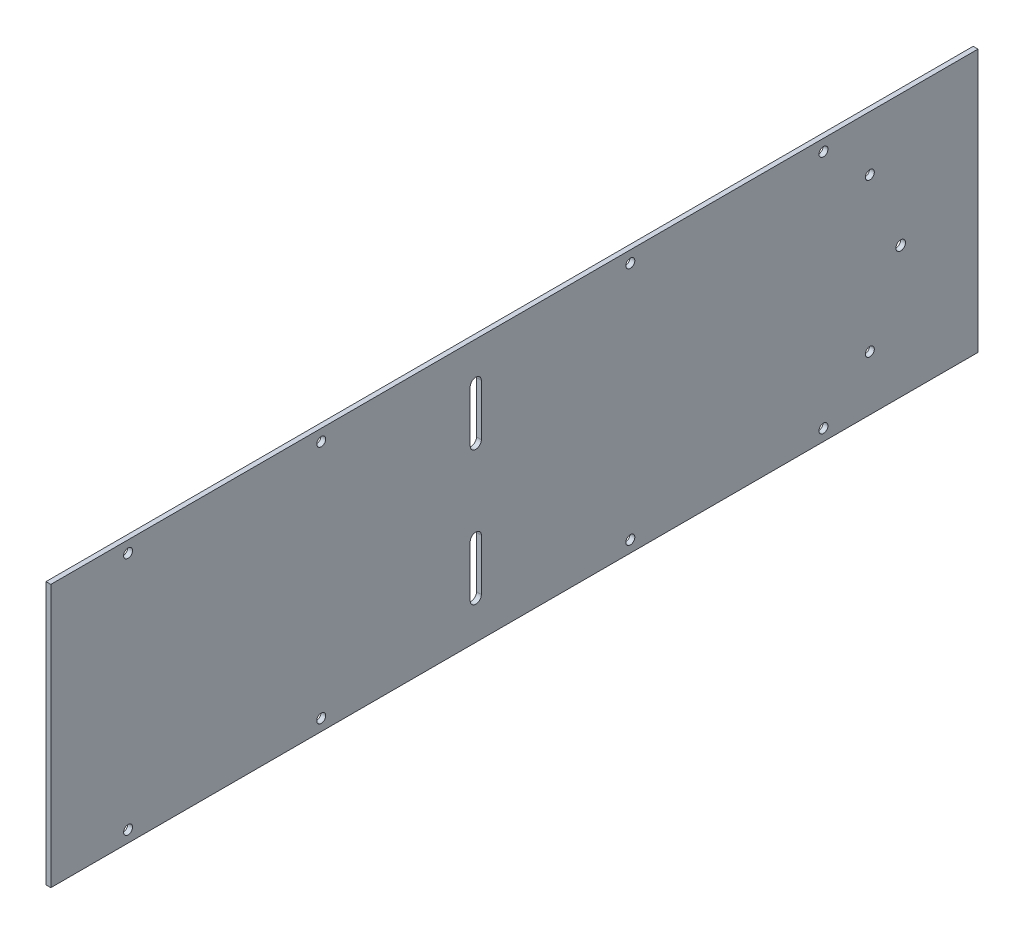
ISO-10303-21;
HEADER;
FILE_DESCRIPTION(('STEP AP214'),'2;1');
FILE_NAME('part.step','',(''),(''),'','','');
FILE_SCHEMA(('AUTOMOTIVE_DESIGN { 1 0 10303 214 1 1 1 1 }'));
ENDSEC;
DATA;
#1=APPLICATION_CONTEXT('core data for automotive mechanical design processes');
#2=APPLICATION_PROTOCOL_DEFINITION('international standard','automotive_design',2000,#1);
#3=PRODUCT_CONTEXT('',#1,'mechanical');
#4=PRODUCT('Part','Part','',(#3));
#5=PRODUCT_RELATED_PRODUCT_CATEGORY('part','',(#4));
#6=PRODUCT_DEFINITION_FORMATION('','',#4);
#7=PRODUCT_DEFINITION_CONTEXT('part definition',#1,'design');
#8=PRODUCT_DEFINITION('design','',#6,#7);
#9=PRODUCT_DEFINITION_SHAPE('','',#8);
#10=(LENGTH_UNIT() NAMED_UNIT(*) SI_UNIT(.MILLI.,.METRE.));
#11=(NAMED_UNIT(*) PLANE_ANGLE_UNIT() SI_UNIT($,.RADIAN.));
#12=(NAMED_UNIT(*) SI_UNIT($,.STERADIAN.) SOLID_ANGLE_UNIT());
#13=UNCERTAINTY_MEASURE_WITH_UNIT(LENGTH_MEASURE(1.E-05),#10,'distance_accuracy_value','');
#14=(GEOMETRIC_REPRESENTATION_CONTEXT(3) GLOBAL_UNCERTAINTY_ASSIGNED_CONTEXT((#13)) GLOBAL_UNIT_ASSIGNED_CONTEXT((#10,
#11,#12)) REPRESENTATION_CONTEXT('',''));
#15=CARTESIAN_POINT('',(0.,0.,0.));
#16=DIRECTION('',(0.,0.,1.));
#17=DIRECTION('',(1.,0.,0.));
#18=AXIS2_PLACEMENT_3D('',#15,#16,#17);
#19=CARTESIAN_POINT('',(1.5875,0.,0.));
#20=DIRECTION('',(0.,0.,-1.));
#21=DIRECTION('',(-1.,0.,0.));
#22=AXIS2_PLACEMENT_3D('',#19,#20,#21);
#23=PLANE('',#22);
#24=DIRECTION('',(0.,-1.,0.));
#25=VECTOR('',#24,1.);
#26=CARTESIAN_POINT('',(0.,0.,0.));
#27=LINE('',#26,#25);
#28=CARTESIAN_POINT('',(0.,86.36,0.));
#29=VERTEX_POINT('',#28);
#30=CARTESIAN_POINT('',(0.,0.,0.));
#31=VERTEX_POINT('',#30);
#32=EDGE_CURVE('E255',#29,#31,#27,.T.);
#33=ORIENTED_EDGE('',*,*,#32,.T.);
#34=DIRECTION('',(-1.,0.,0.));
#35=VECTOR('',#34,1.);
#36=CARTESIAN_POINT('',(1.5875,0.,0.));
#37=LINE('',#36,#35);
#38=CARTESIAN_POINT('',(1.5875,0.,0.));
#39=VERTEX_POINT('',#38);
#40=EDGE_CURVE('E11',#39,#31,#37,.T.);
#41=ORIENTED_EDGE('',*,*,#40,.F.);
#42=DIRECTION('',(0.,-1.,0.));
#43=VECTOR('',#42,1.);
#44=CARTESIAN_POINT('',(1.5875,0.,0.));
#45=LINE('',#44,#43);
#46=CARTESIAN_POINT('',(1.5875,86.36,0.));
#47=VERTEX_POINT('',#46);
#48=EDGE_CURVE('E256',#47,#39,#45,.T.);
#49=ORIENTED_EDGE('',*,*,#48,.F.);
#50=DIRECTION('',(-1.,0.,0.));
#51=VECTOR('',#50,1.);
#52=CARTESIAN_POINT('',(1.5875,86.36,0.));
#53=LINE('',#52,#51);
#54=EDGE_CURVE('E266',#47,#29,#53,.T.);
#55=ORIENTED_EDGE('',*,*,#54,.T.);
#56=EDGE_LOOP('',(#33,#41,#49,#55));
#57=FACE_BOUND('',#56,.T.);
#58=ADVANCED_FACE('F33',(#57),#23,.F.);
#59=CARTESIAN_POINT('',(1.5875,0.,0.));
#60=DIRECTION('',(0.,1.,0.));
#61=DIRECTION('',(0.,0.,1.));
#62=AXIS2_PLACEMENT_3D('',#59,#60,#61);
#63=PLANE('',#62);
#64=DIRECTION('',(0.,0.,-1.));
#65=VECTOR('',#64,1.);
#66=CARTESIAN_POINT('',(0.,0.,0.));
#67=LINE('',#66,#65);
#68=CARTESIAN_POINT('',(0.,0.,-304.8));
#69=VERTEX_POINT('',#68);
#70=EDGE_CURVE('E269',#31,#69,#67,.T.);
#71=ORIENTED_EDGE('',*,*,#70,.T.);
#72=DIRECTION('',(-1.,0.,0.));
#73=VECTOR('',#72,1.);
#74=CARTESIAN_POINT('',(1.5875,0.,-304.8));
#75=LINE('',#74,#73);
#76=CARTESIAN_POINT('',(1.5875,0.,-304.8));
#77=VERTEX_POINT('',#76);
#78=EDGE_CURVE('E40',#77,#69,#75,.T.);
#79=ORIENTED_EDGE('',*,*,#78,.F.);
#80=DIRECTION('',(0.,0.,-1.));
#81=VECTOR('',#80,1.);
#82=CARTESIAN_POINT('',(1.5875,0.,0.));
#83=LINE('',#82,#81);
#84=EDGE_CURVE('E259',#39,#77,#83,.T.);
#85=ORIENTED_EDGE('',*,*,#84,.F.);
#86=ORIENTED_EDGE('',*,*,#40,.T.);
#87=EDGE_LOOP('',(#71,#79,#85,#86));
#88=FACE_BOUND('',#87,.T.);
#89=ADVANCED_FACE('F298',(#88),#63,.F.);
#90=CARTESIAN_POINT('',(1.5875,0.,-304.8));
#91=DIRECTION('',(0.,0.,1.));
#92=DIRECTION('',(1.,0.,0.));
#93=AXIS2_PLACEMENT_3D('',#90,#91,#92);
#94=PLANE('',#93);
#95=DIRECTION('',(0.,1.,0.));
#96=VECTOR('',#95,1.);
#97=CARTESIAN_POINT('',(0.,0.,-304.8));
#98=LINE('',#97,#96);
#99=CARTESIAN_POINT('',(0.,86.36,-304.8));
#100=VERTEX_POINT('',#99);
#101=EDGE_CURVE('E271',#69,#100,#98,.T.);
#102=ORIENTED_EDGE('',*,*,#101,.T.);
#103=DIRECTION('',(-1.,0.,0.));
#104=VECTOR('',#103,1.);
#105=CARTESIAN_POINT('',(1.5875,86.36,-304.8));
#106=LINE('',#105,#104);
#107=CARTESIAN_POINT('',(1.5875,86.36,-304.8));
#108=VERTEX_POINT('',#107);
#109=EDGE_CURVE('E276',#108,#100,#106,.T.);
#110=ORIENTED_EDGE('',*,*,#109,.F.);
#111=DIRECTION('',(0.,1.,0.));
#112=VECTOR('',#111,1.);
#113=CARTESIAN_POINT('',(1.5875,0.,-304.8));
#114=LINE('',#113,#112);
#115=EDGE_CURVE('E262',#77,#108,#114,.T.);
#116=ORIENTED_EDGE('',*,*,#115,.F.);
#117=ORIENTED_EDGE('',*,*,#78,.T.);
#118=EDGE_LOOP('',(#102,#110,#116,#117));
#119=FACE_BOUND('',#118,.T.);
#120=ADVANCED_FACE('F283',(#119),#94,.F.);
#121=CARTESIAN_POINT('',(1.5875,86.36,0.));
#122=DIRECTION('',(0.,-1.,0.));
#123=DIRECTION('',(0.,0.,-1.));
#124=AXIS2_PLACEMENT_3D('',#121,#122,#123);
#125=PLANE('',#124);
#126=DIRECTION('',(0.,0.,1.));
#127=VECTOR('',#126,1.);
#128=CARTESIAN_POINT('',(0.,86.36,0.));
#129=LINE('',#128,#127);
#130=EDGE_CURVE('E260',#100,#29,#129,.T.);
#131=ORIENTED_EDGE('',*,*,#130,.T.);
#132=ORIENTED_EDGE('',*,*,#54,.F.);
#133=DIRECTION('',(0.,0.,1.));
#134=VECTOR('',#133,1.);
#135=CARTESIAN_POINT('',(1.5875,86.36,0.));
#136=LINE('',#135,#134);
#137=EDGE_CURVE('E264',#108,#47,#136,.T.);
#138=ORIENTED_EDGE('',*,*,#137,.F.);
#139=ORIENTED_EDGE('',*,*,#109,.T.);
#140=EDGE_LOOP('',(#131,#132,#138,#139));
#141=FACE_BOUND('',#140,.T.);
#142=ADVANCED_FACE('F291',(#141),#125,.F.);
#143=CARTESIAN_POINT('',(1.5875,0.,0.));
#144=DIRECTION('',(-1.,0.,0.));
#145=DIRECTION('',(0.,0.,1.));
#146=AXIS2_PLACEMENT_3D('',#143,#144,#145);
#147=PLANE('',#146);
#148=DIRECTION('',(0.,1.,0.));
#149=VECTOR('',#148,1.);
#150=CARTESIAN_POINT('',(1.5875,12.7,-141.5288));
#151=LINE('',#150,#149);
#152=CARTESIAN_POINT('',(1.5875,12.7,-141.5288));
#153=VERTEX_POINT('',#152);
#154=CARTESIAN_POINT('',(1.5875,29.5785079684652,-141.5288));
#155=VERTEX_POINT('',#154);
#156=EDGE_CURVE('E148',#153,#155,#151,.T.);
#157=ORIENTED_EDGE('',*,*,#156,.F.);
#158=CARTESIAN_POINT('',(1.5875,12.7,-139.7));
#159=DIRECTION('',(1.,0.,0.));
#160=DIRECTION('',(0.,0.,1.));
#161=AXIS2_PLACEMENT_3D('',#158,#159,#160);
#162=CIRCLE('',#161,1.82879999999999);
#163=CARTESIAN_POINT('',(1.5875,12.7,-137.8712));
#164=VERTEX_POINT('',#163);
#165=EDGE_CURVE('E47',#164,#153,#162,.T.);
#166=ORIENTED_EDGE('',*,*,#165,.F.);
#167=DIRECTION('',(0.,-1.,0.));
#168=VECTOR('',#167,1.);
#169=CARTESIAN_POINT('',(1.5875,12.7,-137.8712));
#170=LINE('',#169,#168);
#171=CARTESIAN_POINT('',(1.5875,29.5785079684652,-137.8712));
#172=VERTEX_POINT('',#171);
#173=EDGE_CURVE('E139',#172,#164,#170,.T.);
#174=ORIENTED_EDGE('',*,*,#173,.F.);
#175=CARTESIAN_POINT('',(1.5875,29.5785079684652,-139.7));
#176=DIRECTION('',(1.,0.,0.));
#177=DIRECTION('',(0.,0.,1.));
#178=AXIS2_PLACEMENT_3D('',#175,#176,#177);
#179=CIRCLE('',#178,1.82879999999999);
#180=EDGE_CURVE('E142',#155,#172,#179,.T.);
#181=ORIENTED_EDGE('',*,*,#180,.F.);
#182=EDGE_LOOP('',(#157,#166,#174,#181));
#183=FACE_BOUND('',#182,.T.);
#184=DIRECTION('',(0.,-1.,0.));
#185=VECTOR('',#184,1.);
#186=CARTESIAN_POINT('',(1.5875,73.66,-137.8712));
#187=LINE('',#186,#185);
#188=CARTESIAN_POINT('',(1.5875,73.66,-137.8712));
#189=VERTEX_POINT('',#188);
#190=CARTESIAN_POINT('',(1.5875,56.7814920315348,-137.8712));
#191=VERTEX_POINT('',#190);
#192=EDGE_CURVE('E173',#189,#191,#187,.T.);
#193=ORIENTED_EDGE('',*,*,#192,.F.);
#194=CARTESIAN_POINT('',(1.5875,73.66,-139.7));
#195=DIRECTION('',(1.,0.,0.));
#196=DIRECTION('',(0.,0.,-1.));
#197=AXIS2_PLACEMENT_3D('',#194,#195,#196);
#198=CIRCLE('',#197,1.82879999999999);
#199=CARTESIAN_POINT('',(1.5875,73.66,-141.5288));
#200=VERTEX_POINT('',#199);
#201=EDGE_CURVE('E154',#200,#189,#198,.T.);
#202=ORIENTED_EDGE('',*,*,#201,.F.);
#203=DIRECTION('',(0.,1.,0.));
#204=VECTOR('',#203,1.);
#205=CARTESIAN_POINT('',(1.5875,73.66,-141.5288));
#206=LINE('',#205,#204);
#207=CARTESIAN_POINT('',(1.5875,56.7814920315348,-141.5288));
#208=VERTEX_POINT('',#207);
#209=EDGE_CURVE('E162',#208,#200,#206,.T.);
#210=ORIENTED_EDGE('',*,*,#209,.F.);
#211=CARTESIAN_POINT('',(1.5875,56.7814920315348,-139.7));
#212=DIRECTION('',(1.,0.,0.));
#213=DIRECTION('',(0.,0.,-1.));
#214=AXIS2_PLACEMENT_3D('',#211,#212,#213);
#215=CIRCLE('',#214,1.82879999999999);
#216=EDGE_CURVE('E176',#191,#208,#215,.T.);
#217=ORIENTED_EDGE('',*,*,#216,.F.);
#218=EDGE_LOOP('',(#193,#202,#210,#217));
#219=FACE_BOUND('',#218,.T.);
#220=CARTESIAN_POINT('',(1.5875,43.18,-279.4));
#221=DIRECTION('',(1.,0.,0.));
#222=DIRECTION('',(0.,0.,-1.));
#223=AXIS2_PLACEMENT_3D('',#220,#221,#222);
#224=CIRCLE('',#223,1.58749999999999);
#225=CARTESIAN_POINT('',(1.5875,43.18,-280.9875));
#226=VERTEX_POINT('',#225);
#227=EDGE_CURVE('E183',#226,#226,#224,.T.);
#228=ORIENTED_EDGE('',*,*,#227,.F.);
#229=EDGE_LOOP('',(#228));
#230=FACE_BOUND('',#229,.T.);
#231=CARTESIAN_POINT('',(1.5875,3.81,-25.4));
#232=DIRECTION('',(1.,0.,0.));
#233=DIRECTION('',(0.,0.,-1.));
#234=AXIS2_PLACEMENT_3D('',#231,#232,#233);
#235=CIRCLE('',#234,1.4732);
#236=CARTESIAN_POINT('',(1.5875,3.81,-26.8732));
#237=VERTEX_POINT('',#236);
#238=EDGE_CURVE('E195',#237,#237,#235,.T.);
#239=ORIENTED_EDGE('',*,*,#238,.F.);
#240=EDGE_LOOP('',(#239));
#241=FACE_BOUND('',#240,.T.);
#242=CARTESIAN_POINT('',(1.5875,3.80999999999999,-88.9));
#243=DIRECTION('',(1.,0.,0.));
#244=DIRECTION('',(0.,0.,-1.));
#245=AXIS2_PLACEMENT_3D('',#242,#243,#244);
#246=CIRCLE('',#245,1.4732);
#247=CARTESIAN_POINT('',(1.5875,3.80999999999999,-90.3732));
#248=VERTEX_POINT('',#247);
#249=EDGE_CURVE('E201',#248,#248,#246,.T.);
#250=ORIENTED_EDGE('',*,*,#249,.F.);
#251=EDGE_LOOP('',(#250));
#252=FACE_BOUND('',#251,.T.);
#253=CARTESIAN_POINT('',(1.5875,3.80999999999999,-190.5));
#254=DIRECTION('',(1.,0.,0.));
#255=DIRECTION('',(0.,0.,-1.));
#256=AXIS2_PLACEMENT_3D('',#253,#254,#255);
#257=CIRCLE('',#256,1.4732);
#258=CARTESIAN_POINT('',(1.5875,3.80999999999999,-191.9732));
#259=VERTEX_POINT('',#258);
#260=EDGE_CURVE('E207',#259,#259,#257,.T.);
#261=ORIENTED_EDGE('',*,*,#260,.F.);
#262=EDGE_LOOP('',(#261));
#263=FACE_BOUND('',#262,.T.);
#264=CARTESIAN_POINT('',(1.5875,3.80999999999999,-254.));
#265=DIRECTION('',(1.,0.,0.));
#266=DIRECTION('',(0.,0.,-1.));
#267=AXIS2_PLACEMENT_3D('',#264,#265,#266);
#268=CIRCLE('',#267,1.4732);
#269=CARTESIAN_POINT('',(1.5875,3.80999999999999,-255.4732));
#270=VERTEX_POINT('',#269);
#271=EDGE_CURVE('E213',#270,#270,#268,.T.);
#272=ORIENTED_EDGE('',*,*,#271,.F.);
#273=EDGE_LOOP('',(#272));
#274=FACE_BOUND('',#273,.T.);
#275=CARTESIAN_POINT('',(1.5875,82.55,-254.));
#276=DIRECTION('',(1.,0.,0.));
#277=DIRECTION('',(0.,0.,-1.));
#278=AXIS2_PLACEMENT_3D('',#275,#276,#277);
#279=CIRCLE('',#278,1.47319999999999);
#280=CARTESIAN_POINT('',(1.5875,82.55,-255.4732));
#281=VERTEX_POINT('',#280);
#282=EDGE_CURVE('E219',#281,#281,#279,.T.);
#283=ORIENTED_EDGE('',*,*,#282,.F.);
#284=EDGE_LOOP('',(#283));
#285=FACE_BOUND('',#284,.T.);
#286=CARTESIAN_POINT('',(1.5875,82.55,-190.5));
#287=DIRECTION('',(1.,0.,0.));
#288=DIRECTION('',(0.,0.,-1.));
#289=AXIS2_PLACEMENT_3D('',#286,#287,#288);
#290=CIRCLE('',#289,1.47319999999999);
#291=CARTESIAN_POINT('',(1.5875,82.55,-191.9732));
#292=VERTEX_POINT('',#291);
#293=EDGE_CURVE('E225',#292,#292,#290,.T.);
#294=ORIENTED_EDGE('',*,*,#293,.F.);
#295=EDGE_LOOP('',(#294));
#296=FACE_BOUND('',#295,.T.);
#297=CARTESIAN_POINT('',(1.5875,82.55,-88.9));
#298=DIRECTION('',(1.,0.,0.));
#299=DIRECTION('',(0.,0.,-1.));
#300=AXIS2_PLACEMENT_3D('',#297,#298,#299);
#301=CIRCLE('',#300,1.47319999999999);
#302=CARTESIAN_POINT('',(1.5875,82.55,-90.3732));
#303=VERTEX_POINT('',#302);
#304=EDGE_CURVE('E231',#303,#303,#301,.T.);
#305=ORIENTED_EDGE('',*,*,#304,.F.);
#306=EDGE_LOOP('',(#305));
#307=FACE_BOUND('',#306,.T.);
#308=CARTESIAN_POINT('',(1.5875,82.55,-25.4));
#309=DIRECTION('',(1.,0.,0.));
#310=DIRECTION('',(0.,0.,-1.));
#311=AXIS2_PLACEMENT_3D('',#308,#309,#310);
#312=CIRCLE('',#311,1.47319999999999);
#313=CARTESIAN_POINT('',(1.5875,82.55,-26.8732));
#314=VERTEX_POINT('',#313);
#315=EDGE_CURVE('E237',#314,#314,#312,.T.);
#316=ORIENTED_EDGE('',*,*,#315,.F.);
#317=EDGE_LOOP('',(#316));
#318=FACE_BOUND('',#317,.T.);
#319=CARTESIAN_POINT('',(1.5875,18.,-269.24));
#320=DIRECTION('',(1.,0.,0.));
#321=DIRECTION('',(0.,0.,-1.));
#322=AXIS2_PLACEMENT_3D('',#319,#320,#321);
#323=CIRCLE('',#322,1.4732);
#324=CARTESIAN_POINT('',(1.5875,18.,-270.7132));
#325=VERTEX_POINT('',#324);
#326=EDGE_CURVE('E243',#325,#325,#323,.T.);
#327=ORIENTED_EDGE('',*,*,#326,.F.);
#328=EDGE_LOOP('',(#327));
#329=FACE_BOUND('',#328,.T.);
#330=CARTESIAN_POINT('',(1.5875,68.36,-269.24));
#331=DIRECTION('',(1.,0.,0.));
#332=DIRECTION('',(0.,0.,-1.));
#333=AXIS2_PLACEMENT_3D('',#330,#331,#332);
#334=CIRCLE('',#333,1.47319999999999);
#335=CARTESIAN_POINT('',(1.5875,68.36,-270.7132));
#336=VERTEX_POINT('',#335);
#337=EDGE_CURVE('E249',#336,#336,#334,.T.);
#338=ORIENTED_EDGE('',*,*,#337,.F.);
#339=EDGE_LOOP('',(#338));
#340=FACE_BOUND('',#339,.T.);
#341=ORIENTED_EDGE('',*,*,#48,.T.);
#342=ORIENTED_EDGE('',*,*,#84,.T.);
#343=ORIENTED_EDGE('',*,*,#115,.T.);
#344=ORIENTED_EDGE('',*,*,#137,.T.);
#345=EDGE_LOOP('',(#341,#342,#343,#344));
#346=FACE_BOUND('',#345,.T.);
#347=ADVANCED_FACE('F297',(#183,#219,#230,#241,#252,#263,#274,#285,#296,#307,#318,#329,#340,
#346),#147,.F.);
#348=CARTESIAN_POINT('',(0.,0.,0.));
#349=DIRECTION('',(-1.,0.,0.));
#350=DIRECTION('',(0.,0.,1.));
#351=AXIS2_PLACEMENT_3D('',#348,#349,#350);
#352=PLANE('',#351);
#353=CARTESIAN_POINT('',(0.,12.7,-139.7));
#354=DIRECTION('',(1.,0.,0.));
#355=DIRECTION('',(0.,0.,1.));
#356=AXIS2_PLACEMENT_3D('',#353,#354,#355);
#357=CIRCLE('',#356,1.82879999999999);
#358=CARTESIAN_POINT('',(0.,12.7,-137.8712));
#359=VERTEX_POINT('',#358);
#360=CARTESIAN_POINT('',(0.,12.7,-141.5288));
#361=VERTEX_POINT('',#360);
#362=EDGE_CURVE('E123',#359,#361,#357,.T.);
#363=ORIENTED_EDGE('',*,*,#362,.T.);
#364=DIRECTION('',(0.,1.,0.));
#365=VECTOR('',#364,1.);
#366=CARTESIAN_POINT('',(0.,12.7,-141.5288));
#367=LINE('',#366,#365);
#368=CARTESIAN_POINT('',(0.,29.5785079684652,-141.5288));
#369=VERTEX_POINT('',#368);
#370=EDGE_CURVE('E132',#361,#369,#367,.T.);
#371=ORIENTED_EDGE('',*,*,#370,.T.);
#372=CARTESIAN_POINT('',(0.,29.5785079684652,-139.7));
#373=DIRECTION('',(1.,0.,0.));
#374=DIRECTION('',(0.,0.,1.));
#375=AXIS2_PLACEMENT_3D('',#372,#373,#374);
#376=CIRCLE('',#375,1.82879999999999);
#377=CARTESIAN_POINT('',(0.,29.5785079684652,-137.8712));
#378=VERTEX_POINT('',#377);
#379=EDGE_CURVE('E55',#369,#378,#376,.T.);
#380=ORIENTED_EDGE('',*,*,#379,.T.);
#381=DIRECTION('',(0.,-1.,0.));
#382=VECTOR('',#381,1.);
#383=CARTESIAN_POINT('',(0.,12.7,-137.8712));
#384=LINE('',#383,#382);
#385=EDGE_CURVE('E129',#378,#359,#384,.T.);
#386=ORIENTED_EDGE('',*,*,#385,.T.);
#387=EDGE_LOOP('',(#363,#371,#380,#386));
#388=FACE_BOUND('',#387,.T.);
#389=CARTESIAN_POINT('',(0.,73.66,-139.7));
#390=DIRECTION('',(1.,0.,0.));
#391=DIRECTION('',(0.,0.,-1.));
#392=AXIS2_PLACEMENT_3D('',#389,#390,#391);
#393=CIRCLE('',#392,1.82879999999999);
#394=CARTESIAN_POINT('',(0.,73.66,-141.5288));
#395=VERTEX_POINT('',#394);
#396=CARTESIAN_POINT('',(0.,73.66,-137.8712));
#397=VERTEX_POINT('',#396);
#398=EDGE_CURVE('E158',#395,#397,#393,.T.);
#399=ORIENTED_EDGE('',*,*,#398,.T.);
#400=DIRECTION('',(0.,-1.,0.));
#401=VECTOR('',#400,1.);
#402=CARTESIAN_POINT('',(0.,73.66,-137.8712));
#403=LINE('',#402,#401);
#404=CARTESIAN_POINT('',(0.,56.7814920315348,-137.8712));
#405=VERTEX_POINT('',#404);
#406=EDGE_CURVE('E161',#397,#405,#403,.T.);
#407=ORIENTED_EDGE('',*,*,#406,.T.);
#408=CARTESIAN_POINT('',(0.,56.7814920315348,-139.7));
#409=DIRECTION('',(1.,0.,0.));
#410=DIRECTION('',(0.,0.,-1.));
#411=AXIS2_PLACEMENT_3D('',#408,#409,#410);
#412=CIRCLE('',#411,1.82879999999999);
#413=CARTESIAN_POINT('',(0.,56.7814920315348,-141.5288));
#414=VERTEX_POINT('',#413);
#415=EDGE_CURVE('E165',#405,#414,#412,.T.);
#416=ORIENTED_EDGE('',*,*,#415,.T.);
#417=DIRECTION('',(0.,1.,0.));
#418=VECTOR('',#417,1.);
#419=CARTESIAN_POINT('',(0.,73.66,-141.5288));
#420=LINE('',#419,#418);
#421=EDGE_CURVE('E168',#414,#395,#420,.T.);
#422=ORIENTED_EDGE('',*,*,#421,.T.);
#423=EDGE_LOOP('',(#399,#407,#416,#422));
#424=FACE_BOUND('',#423,.T.);
#425=CARTESIAN_POINT('',(0.,43.18,-279.4));
#426=DIRECTION('',(1.,0.,0.));
#427=DIRECTION('',(0.,0.,-1.));
#428=AXIS2_PLACEMENT_3D('',#425,#426,#427);
#429=CIRCLE('',#428,1.5875);
#430=CARTESIAN_POINT('',(0.,43.18,-280.9875));
#431=VERTEX_POINT('',#430);
#432=EDGE_CURVE('E192',#431,#431,#429,.T.);
#433=ORIENTED_EDGE('',*,*,#432,.T.);
#434=EDGE_LOOP('',(#433));
#435=FACE_BOUND('',#434,.T.);
#436=CARTESIAN_POINT('',(0.,3.81,-25.4));
#437=DIRECTION('',(1.,0.,0.));
#438=DIRECTION('',(0.,0.,-1.));
#439=AXIS2_PLACEMENT_3D('',#436,#437,#438);
#440=CIRCLE('',#439,1.4732);
#441=CARTESIAN_POINT('',(0.,3.81,-26.8732));
#442=VERTEX_POINT('',#441);
#443=EDGE_CURVE('E198',#442,#442,#440,.T.);
#444=ORIENTED_EDGE('',*,*,#443,.T.);
#445=EDGE_LOOP('',(#444));
#446=FACE_BOUND('',#445,.T.);
#447=CARTESIAN_POINT('',(0.,3.80999999999999,-88.9));
#448=DIRECTION('',(1.,0.,0.));
#449=DIRECTION('',(0.,0.,-1.));
#450=AXIS2_PLACEMENT_3D('',#447,#448,#449);
#451=CIRCLE('',#450,1.4732);
#452=CARTESIAN_POINT('',(0.,3.80999999999999,-90.3732));
#453=VERTEX_POINT('',#452);
#454=EDGE_CURVE('E204',#453,#453,#451,.T.);
#455=ORIENTED_EDGE('',*,*,#454,.T.);
#456=EDGE_LOOP('',(#455));
#457=FACE_BOUND('',#456,.T.);
#458=CARTESIAN_POINT('',(0.,3.80999999999999,-190.5));
#459=DIRECTION('',(1.,0.,0.));
#460=DIRECTION('',(0.,0.,-1.));
#461=AXIS2_PLACEMENT_3D('',#458,#459,#460);
#462=CIRCLE('',#461,1.4732);
#463=CARTESIAN_POINT('',(0.,3.80999999999999,-191.9732));
#464=VERTEX_POINT('',#463);
#465=EDGE_CURVE('E210',#464,#464,#462,.T.);
#466=ORIENTED_EDGE('',*,*,#465,.T.);
#467=EDGE_LOOP('',(#466));
#468=FACE_BOUND('',#467,.T.);
#469=CARTESIAN_POINT('',(0.,3.80999999999999,-254.));
#470=DIRECTION('',(1.,0.,0.));
#471=DIRECTION('',(0.,0.,-1.));
#472=AXIS2_PLACEMENT_3D('',#469,#470,#471);
#473=CIRCLE('',#472,1.4732);
#474=CARTESIAN_POINT('',(0.,3.80999999999999,-255.4732));
#475=VERTEX_POINT('',#474);
#476=EDGE_CURVE('E216',#475,#475,#473,.T.);
#477=ORIENTED_EDGE('',*,*,#476,.T.);
#478=EDGE_LOOP('',(#477));
#479=FACE_BOUND('',#478,.T.);
#480=CARTESIAN_POINT('',(0.,82.55,-254.));
#481=DIRECTION('',(1.,0.,0.));
#482=DIRECTION('',(0.,0.,-1.));
#483=AXIS2_PLACEMENT_3D('',#480,#481,#482);
#484=CIRCLE('',#483,1.47319999999999);
#485=CARTESIAN_POINT('',(0.,82.55,-255.4732));
#486=VERTEX_POINT('',#485);
#487=EDGE_CURVE('E222',#486,#486,#484,.T.);
#488=ORIENTED_EDGE('',*,*,#487,.T.);
#489=EDGE_LOOP('',(#488));
#490=FACE_BOUND('',#489,.T.);
#491=CARTESIAN_POINT('',(0.,82.55,-190.5));
#492=DIRECTION('',(1.,0.,0.));
#493=DIRECTION('',(0.,0.,-1.));
#494=AXIS2_PLACEMENT_3D('',#491,#492,#493);
#495=CIRCLE('',#494,1.47319999999999);
#496=CARTESIAN_POINT('',(0.,82.55,-191.9732));
#497=VERTEX_POINT('',#496);
#498=EDGE_CURVE('E228',#497,#497,#495,.T.);
#499=ORIENTED_EDGE('',*,*,#498,.T.);
#500=EDGE_LOOP('',(#499));
#501=FACE_BOUND('',#500,.T.);
#502=CARTESIAN_POINT('',(0.,82.55,-88.9));
#503=DIRECTION('',(1.,0.,0.));
#504=DIRECTION('',(0.,0.,-1.));
#505=AXIS2_PLACEMENT_3D('',#502,#503,#504);
#506=CIRCLE('',#505,1.47319999999999);
#507=CARTESIAN_POINT('',(0.,82.55,-90.3732));
#508=VERTEX_POINT('',#507);
#509=EDGE_CURVE('E234',#508,#508,#506,.T.);
#510=ORIENTED_EDGE('',*,*,#509,.T.);
#511=EDGE_LOOP('',(#510));
#512=FACE_BOUND('',#511,.T.);
#513=CARTESIAN_POINT('',(0.,82.55,-25.4));
#514=DIRECTION('',(1.,0.,0.));
#515=DIRECTION('',(0.,0.,-1.));
#516=AXIS2_PLACEMENT_3D('',#513,#514,#515);
#517=CIRCLE('',#516,1.47319999999999);
#518=CARTESIAN_POINT('',(0.,82.55,-26.8732));
#519=VERTEX_POINT('',#518);
#520=EDGE_CURVE('E240',#519,#519,#517,.T.);
#521=ORIENTED_EDGE('',*,*,#520,.T.);
#522=EDGE_LOOP('',(#521));
#523=FACE_BOUND('',#522,.T.);
#524=CARTESIAN_POINT('',(0.,18.,-269.24));
#525=DIRECTION('',(1.,0.,0.));
#526=DIRECTION('',(0.,0.,-1.));
#527=AXIS2_PLACEMENT_3D('',#524,#525,#526);
#528=CIRCLE('',#527,1.4732);
#529=CARTESIAN_POINT('',(0.,18.,-270.7132));
#530=VERTEX_POINT('',#529);
#531=EDGE_CURVE('E246',#530,#530,#528,.T.);
#532=ORIENTED_EDGE('',*,*,#531,.T.);
#533=EDGE_LOOP('',(#532));
#534=FACE_BOUND('',#533,.T.);
#535=CARTESIAN_POINT('',(0.,68.36,-269.24));
#536=DIRECTION('',(1.,0.,0.));
#537=DIRECTION('',(0.,0.,-1.));
#538=AXIS2_PLACEMENT_3D('',#535,#536,#537);
#539=CIRCLE('',#538,1.47319999999999);
#540=CARTESIAN_POINT('',(0.,68.36,-270.7132));
#541=VERTEX_POINT('',#540);
#542=EDGE_CURVE('E252',#541,#541,#539,.T.);
#543=ORIENTED_EDGE('',*,*,#542,.T.);
#544=EDGE_LOOP('',(#543));
#545=FACE_BOUND('',#544,.T.);
#546=ORIENTED_EDGE('',*,*,#32,.F.);
#547=ORIENTED_EDGE('',*,*,#130,.F.);
#548=ORIENTED_EDGE('',*,*,#101,.F.);
#549=ORIENTED_EDGE('',*,*,#70,.F.);
#550=EDGE_LOOP('',(#546,#547,#548,#549));
#551=FACE_BOUND('',#550,.T.);
#552=ADVANCED_FACE('F136',(#388,#424,#435,#446,#457,#468,#479,#490,#501,#512,#523,#534,#545,
#551),#352,.T.);
#553=CARTESIAN_POINT('',(1.5875,68.36,-269.24));
#554=DIRECTION('',(1.,0.,0.));
#555=DIRECTION('',(0.,0.,-1.));
#556=AXIS2_PLACEMENT_3D('',#553,#554,#555);
#557=CYLINDRICAL_SURFACE('',#556,1.47319999999999);
#558=ORIENTED_EDGE('',*,*,#542,.F.);
#559=EDGE_LOOP('',(#558));
#560=FACE_BOUND('',#559,.T.);
#561=ORIENTED_EDGE('',*,*,#337,.T.);
#562=EDGE_LOOP('',(#561));
#563=FACE_BOUND('',#562,.T.);
#564=ADVANCED_FACE('F310',(#560,#563),#557,.F.);
#565=CARTESIAN_POINT('',(1.5875,18.,-269.24));
#566=DIRECTION('',(1.,0.,0.));
#567=DIRECTION('',(0.,0.,-1.));
#568=AXIS2_PLACEMENT_3D('',#565,#566,#567);
#569=CYLINDRICAL_SURFACE('',#568,1.4732);
#570=ORIENTED_EDGE('',*,*,#531,.F.);
#571=EDGE_LOOP('',(#570));
#572=FACE_BOUND('',#571,.T.);
#573=ORIENTED_EDGE('',*,*,#326,.T.);
#574=EDGE_LOOP('',(#573));
#575=FACE_BOUND('',#574,.T.);
#576=ADVANCED_FACE('F316',(#572,#575),#569,.F.);
#577=CARTESIAN_POINT('',(1.5875,82.55,-25.4));
#578=DIRECTION('',(1.,0.,0.));
#579=DIRECTION('',(0.,0.,-1.));
#580=AXIS2_PLACEMENT_3D('',#577,#578,#579);
#581=CYLINDRICAL_SURFACE('',#580,1.47319999999999);
#582=ORIENTED_EDGE('',*,*,#520,.F.);
#583=EDGE_LOOP('',(#582));
#584=FACE_BOUND('',#583,.T.);
#585=ORIENTED_EDGE('',*,*,#315,.T.);
#586=EDGE_LOOP('',(#585));
#587=FACE_BOUND('',#586,.T.);
#588=ADVANCED_FACE('F320',(#584,#587),#581,.F.);
#589=CARTESIAN_POINT('',(1.5875,82.55,-88.9));
#590=DIRECTION('',(1.,0.,0.));
#591=DIRECTION('',(0.,0.,-1.));
#592=AXIS2_PLACEMENT_3D('',#589,#590,#591);
#593=CYLINDRICAL_SURFACE('',#592,1.47319999999999);
#594=ORIENTED_EDGE('',*,*,#509,.F.);
#595=EDGE_LOOP('',(#594));
#596=FACE_BOUND('',#595,.T.);
#597=ORIENTED_EDGE('',*,*,#304,.T.);
#598=EDGE_LOOP('',(#597));
#599=FACE_BOUND('',#598,.T.);
#600=ADVANCED_FACE('F324',(#596,#599),#593,.F.);
#601=CARTESIAN_POINT('',(1.5875,82.55,-190.5));
#602=DIRECTION('',(1.,0.,0.));
#603=DIRECTION('',(0.,0.,-1.));
#604=AXIS2_PLACEMENT_3D('',#601,#602,#603);
#605=CYLINDRICAL_SURFACE('',#604,1.47319999999999);
#606=ORIENTED_EDGE('',*,*,#498,.F.);
#607=EDGE_LOOP('',(#606));
#608=FACE_BOUND('',#607,.T.);
#609=ORIENTED_EDGE('',*,*,#293,.T.);
#610=EDGE_LOOP('',(#609));
#611=FACE_BOUND('',#610,.T.);
#612=ADVANCED_FACE('F328',(#608,#611),#605,.F.);
#613=CARTESIAN_POINT('',(1.5875,82.55,-254.));
#614=DIRECTION('',(1.,0.,0.));
#615=DIRECTION('',(0.,0.,-1.));
#616=AXIS2_PLACEMENT_3D('',#613,#614,#615);
#617=CYLINDRICAL_SURFACE('',#616,1.47319999999999);
#618=ORIENTED_EDGE('',*,*,#487,.F.);
#619=EDGE_LOOP('',(#618));
#620=FACE_BOUND('',#619,.T.);
#621=ORIENTED_EDGE('',*,*,#282,.T.);
#622=EDGE_LOOP('',(#621));
#623=FACE_BOUND('',#622,.T.);
#624=ADVANCED_FACE('F332',(#620,#623),#617,.F.);
#625=CARTESIAN_POINT('',(1.5875,3.80999999999999,-254.));
#626=DIRECTION('',(1.,0.,0.));
#627=DIRECTION('',(0.,0.,-1.));
#628=AXIS2_PLACEMENT_3D('',#625,#626,#627);
#629=CYLINDRICAL_SURFACE('',#628,1.4732);
#630=ORIENTED_EDGE('',*,*,#476,.F.);
#631=EDGE_LOOP('',(#630));
#632=FACE_BOUND('',#631,.T.);
#633=ORIENTED_EDGE('',*,*,#271,.T.);
#634=EDGE_LOOP('',(#633));
#635=FACE_BOUND('',#634,.T.);
#636=ADVANCED_FACE('F336',(#632,#635),#629,.F.);
#637=CARTESIAN_POINT('',(1.5875,3.80999999999999,-190.5));
#638=DIRECTION('',(1.,0.,0.));
#639=DIRECTION('',(0.,0.,-1.));
#640=AXIS2_PLACEMENT_3D('',#637,#638,#639);
#641=CYLINDRICAL_SURFACE('',#640,1.4732);
#642=ORIENTED_EDGE('',*,*,#465,.F.);
#643=EDGE_LOOP('',(#642));
#644=FACE_BOUND('',#643,.T.);
#645=ORIENTED_EDGE('',*,*,#260,.T.);
#646=EDGE_LOOP('',(#645));
#647=FACE_BOUND('',#646,.T.);
#648=ADVANCED_FACE('F340',(#644,#647),#641,.F.);
#649=CARTESIAN_POINT('',(1.5875,3.80999999999999,-88.9));
#650=DIRECTION('',(1.,0.,0.));
#651=DIRECTION('',(0.,0.,-1.));
#652=AXIS2_PLACEMENT_3D('',#649,#650,#651);
#653=CYLINDRICAL_SURFACE('',#652,1.4732);
#654=ORIENTED_EDGE('',*,*,#454,.F.);
#655=EDGE_LOOP('',(#654));
#656=FACE_BOUND('',#655,.T.);
#657=ORIENTED_EDGE('',*,*,#249,.T.);
#658=EDGE_LOOP('',(#657));
#659=FACE_BOUND('',#658,.T.);
#660=ADVANCED_FACE('F344',(#656,#659),#653,.F.);
#661=CARTESIAN_POINT('',(1.5875,3.81,-25.4));
#662=DIRECTION('',(1.,0.,0.));
#663=DIRECTION('',(0.,0.,-1.));
#664=AXIS2_PLACEMENT_3D('',#661,#662,#663);
#665=CYLINDRICAL_SURFACE('',#664,1.4732);
#666=ORIENTED_EDGE('',*,*,#443,.F.);
#667=EDGE_LOOP('',(#666));
#668=FACE_BOUND('',#667,.T.);
#669=ORIENTED_EDGE('',*,*,#238,.T.);
#670=EDGE_LOOP('',(#669));
#671=FACE_BOUND('',#670,.T.);
#672=ADVANCED_FACE('F348',(#668,#671),#665,.F.);
#673=CARTESIAN_POINT('',(1.5875,43.18,-279.4));
#674=DIRECTION('',(1.,0.,0.));
#675=DIRECTION('',(0.,0.,-1.));
#676=AXIS2_PLACEMENT_3D('',#673,#674,#675);
#677=CYLINDRICAL_SURFACE('',#676,1.5875);
#678=ORIENTED_EDGE('',*,*,#432,.F.);
#679=EDGE_LOOP('',(#678));
#680=FACE_BOUND('',#679,.T.);
#681=ORIENTED_EDGE('',*,*,#227,.T.);
#682=EDGE_LOOP('',(#681));
#683=FACE_BOUND('',#682,.T.);
#684=ADVANCED_FACE('F352',(#680,#683),#677,.F.);
#685=CARTESIAN_POINT('',(0.,73.66,-139.7));
#686=DIRECTION('',(1.,0.,0.));
#687=DIRECTION('',(0.,0.,-1.));
#688=AXIS2_PLACEMENT_3D('',#685,#686,#687);
#689=CYLINDRICAL_SURFACE('',#688,1.82879999999999);
#690=ORIENTED_EDGE('',*,*,#201,.T.);
#691=DIRECTION('',(1.,0.,0.));
#692=VECTOR('',#691,1.);
#693=CARTESIAN_POINT('',(0.,73.66,-137.8712));
#694=LINE('',#693,#692);
#695=EDGE_CURVE('E171',#397,#189,#694,.T.);
#696=ORIENTED_EDGE('',*,*,#695,.F.);
#697=ORIENTED_EDGE('',*,*,#398,.F.);
#698=DIRECTION('',(1.,0.,0.));
#699=VECTOR('',#698,1.);
#700=CARTESIAN_POINT('',(0.,73.66,-141.5288));
#701=LINE('',#700,#699);
#702=EDGE_CURVE('E181',#395,#200,#701,.T.);
#703=ORIENTED_EDGE('',*,*,#702,.T.);
#704=EDGE_LOOP('',(#690,#696,#697,#703));
#705=FACE_BOUND('',#704,.T.);
#706=ADVANCED_FACE('F356',(#705),#689,.F.);
#707=CARTESIAN_POINT('',(0.,73.66,-141.5288));
#708=DIRECTION('',(0.,0.,-1.));
#709=DIRECTION('',(-1.,0.,0.));
#710=AXIS2_PLACEMENT_3D('',#707,#708,#709);
#711=PLANE('',#710);
#712=ORIENTED_EDGE('',*,*,#209,.T.);
#713=ORIENTED_EDGE('',*,*,#702,.F.);
#714=ORIENTED_EDGE('',*,*,#421,.F.);
#715=DIRECTION('',(1.,0.,0.));
#716=VECTOR('',#715,1.);
#717=CARTESIAN_POINT('',(0.,56.7814920315348,-141.5288));
#718=LINE('',#717,#716);
#719=EDGE_CURVE('E184',#414,#208,#718,.T.);
#720=ORIENTED_EDGE('',*,*,#719,.T.);
#721=EDGE_LOOP('',(#712,#713,#714,#720));
#722=FACE_BOUND('',#721,.T.);
#723=ADVANCED_FACE('F360',(#722),#711,.F.);
#724=CARTESIAN_POINT('',(0.,56.7814920315348,-139.7));
#725=DIRECTION('',(1.,0.,0.));
#726=DIRECTION('',(0.,0.,-1.));
#727=AXIS2_PLACEMENT_3D('',#724,#725,#726);
#728=CYLINDRICAL_SURFACE('',#727,1.82879999999999);
#729=ORIENTED_EDGE('',*,*,#216,.T.);
#730=ORIENTED_EDGE('',*,*,#719,.F.);
#731=ORIENTED_EDGE('',*,*,#415,.F.);
#732=DIRECTION('',(1.,0.,0.));
#733=VECTOR('',#732,1.);
#734=CARTESIAN_POINT('',(0.,56.7814920315348,-137.8712));
#735=LINE('',#734,#733);
#736=EDGE_CURVE('E186',#405,#191,#735,.T.);
#737=ORIENTED_EDGE('',*,*,#736,.T.);
#738=EDGE_LOOP('',(#729,#730,#731,#737));
#739=FACE_BOUND('',#738,.T.);
#740=ADVANCED_FACE('F365',(#739),#728,.F.);
#741=CARTESIAN_POINT('',(0.,73.66,-137.8712));
#742=DIRECTION('',(0.,0.,1.));
#743=DIRECTION('',(1.,0.,0.));
#744=AXIS2_PLACEMENT_3D('',#741,#742,#743);
#745=PLANE('',#744);
#746=ORIENTED_EDGE('',*,*,#192,.T.);
#747=ORIENTED_EDGE('',*,*,#736,.F.);
#748=ORIENTED_EDGE('',*,*,#406,.F.);
#749=ORIENTED_EDGE('',*,*,#695,.T.);
#750=EDGE_LOOP('',(#746,#747,#748,#749));
#751=FACE_BOUND('',#750,.T.);
#752=ADVANCED_FACE('F362',(#751),#745,.F.);
#753=CARTESIAN_POINT('',(0.,12.7,-139.7));
#754=DIRECTION('',(1.,0.,0.));
#755=DIRECTION('',(0.,0.,-1.));
#756=AXIS2_PLACEMENT_3D('',#753,#754,#755);
#757=CYLINDRICAL_SURFACE('',#756,1.82879999999999);
#758=ORIENTED_EDGE('',*,*,#165,.T.);
#759=DIRECTION('',(1.,0.,0.));
#760=VECTOR('',#759,1.);
#761=CARTESIAN_POINT('',(0.,12.7,-141.5288));
#762=LINE('',#761,#760);
#763=EDGE_CURVE('E119',#361,#153,#762,.T.);
#764=ORIENTED_EDGE('',*,*,#763,.F.);
#765=ORIENTED_EDGE('',*,*,#362,.F.);
#766=DIRECTION('',(1.,0.,0.));
#767=VECTOR('',#766,1.);
#768=CARTESIAN_POINT('',(0.,12.7,-137.8712));
#769=LINE('',#768,#767);
#770=EDGE_CURVE('E152',#359,#164,#769,.T.);
#771=ORIENTED_EDGE('',*,*,#770,.T.);
#772=EDGE_LOOP('',(#758,#764,#765,#771));
#773=FACE_BOUND('',#772,.T.);
#774=ADVANCED_FACE('F121',(#773),#757,.F.);
#775=CARTESIAN_POINT('',(0.,12.7,-137.8712));
#776=DIRECTION('',(0.,0.,1.));
#777=DIRECTION('',(1.,0.,0.));
#778=AXIS2_PLACEMENT_3D('',#775,#776,#777);
#779=PLANE('',#778);
#780=ORIENTED_EDGE('',*,*,#173,.T.);
#781=ORIENTED_EDGE('',*,*,#770,.F.);
#782=ORIENTED_EDGE('',*,*,#385,.F.);
#783=DIRECTION('',(1.,0.,0.));
#784=VECTOR('',#783,1.);
#785=CARTESIAN_POINT('',(0.,29.5785079684652,-137.8712));
#786=LINE('',#785,#784);
#787=EDGE_CURVE('E155',#378,#172,#786,.T.);
#788=ORIENTED_EDGE('',*,*,#787,.T.);
#789=EDGE_LOOP('',(#780,#781,#782,#788));
#790=FACE_BOUND('',#789,.T.);
#791=ADVANCED_FACE('F375',(#790),#779,.F.);
#792=CARTESIAN_POINT('',(0.,29.5785079684652,-139.7));
#793=DIRECTION('',(1.,0.,0.));
#794=DIRECTION('',(0.,0.,-1.));
#795=AXIS2_PLACEMENT_3D('',#792,#793,#794);
#796=CYLINDRICAL_SURFACE('',#795,1.82879999999999);
#797=ORIENTED_EDGE('',*,*,#180,.T.);
#798=ORIENTED_EDGE('',*,*,#787,.F.);
#799=ORIENTED_EDGE('',*,*,#379,.F.);
#800=DIRECTION('',(1.,0.,0.));
#801=VECTOR('',#800,1.);
#802=CARTESIAN_POINT('',(0.,29.5785079684652,-141.5288));
#803=LINE('',#802,#801);
#804=EDGE_CURVE('E128',#369,#155,#803,.T.);
#805=ORIENTED_EDGE('',*,*,#804,.T.);
#806=EDGE_LOOP('',(#797,#798,#799,#805));
#807=FACE_BOUND('',#806,.T.);
#808=ADVANCED_FACE('F378',(#807),#796,.F.);
#809=CARTESIAN_POINT('',(0.,12.7,-141.5288));
#810=DIRECTION('',(0.,0.,-1.));
#811=DIRECTION('',(-1.,0.,0.));
#812=AXIS2_PLACEMENT_3D('',#809,#810,#811);
#813=PLANE('',#812);
#814=ORIENTED_EDGE('',*,*,#156,.T.);
#815=ORIENTED_EDGE('',*,*,#804,.F.);
#816=ORIENTED_EDGE('',*,*,#370,.F.);
#817=ORIENTED_EDGE('',*,*,#763,.T.);
#818=EDGE_LOOP('',(#814,#815,#816,#817));
#819=FACE_BOUND('',#818,.T.);
#820=ADVANCED_FACE('F133',(#819),#813,.F.);
#821=CLOSED_SHELL('',(#58,#89,#120,#142,#347,#552,#564,#576,#588,#600,#612,#624,#636,#648,#660,
#672,#684,#706,#723,#740,#752,#774,#791,#808,#820));
#822=MANIFOLD_SOLID_BREP('B2',#821);
#823=ADVANCED_BREP_SHAPE_REPRESENTATION('',(#18,#822),#14);
#824=SHAPE_DEFINITION_REPRESENTATION(#9,#823);
ENDSEC;
END-ISO-10303-21;
